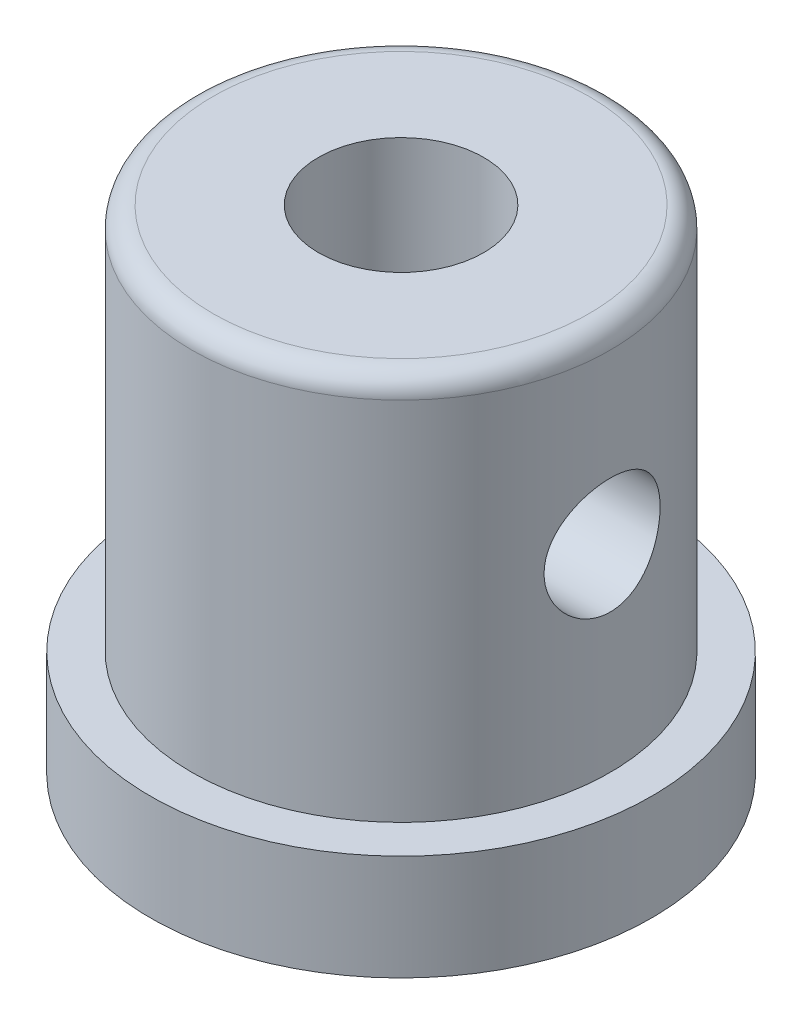
ISO-10303-21;
HEADER;
FILE_DESCRIPTION(('STEP AP214'),'2;1');
FILE_NAME('part.step','',(''),(''),'','','');
FILE_SCHEMA(('AUTOMOTIVE_DESIGN { 1 0 10303 214 1 1 1 1 }'));
ENDSEC;
DATA;
#1=APPLICATION_CONTEXT('core data for automotive mechanical design processes');
#2=APPLICATION_PROTOCOL_DEFINITION('international standard','automotive_design',2000,#1);
#3=PRODUCT_CONTEXT('',#1,'mechanical');
#4=PRODUCT('Part','Part','',(#3));
#5=PRODUCT_RELATED_PRODUCT_CATEGORY('part','',(#4));
#6=PRODUCT_DEFINITION_FORMATION('','',#4);
#7=PRODUCT_DEFINITION_CONTEXT('part definition',#1,'design');
#8=PRODUCT_DEFINITION('design','',#6,#7);
#9=PRODUCT_DEFINITION_SHAPE('','',#8);
#10=(LENGTH_UNIT() NAMED_UNIT(*) SI_UNIT(.MILLI.,.METRE.));
#11=(NAMED_UNIT(*) PLANE_ANGLE_UNIT() SI_UNIT($,.RADIAN.));
#12=(NAMED_UNIT(*) SI_UNIT($,.STERADIAN.) SOLID_ANGLE_UNIT());
#13=UNCERTAINTY_MEASURE_WITH_UNIT(LENGTH_MEASURE(1.E-05),#10,'distance_accuracy_value','');
#14=(GEOMETRIC_REPRESENTATION_CONTEXT(3) GLOBAL_UNCERTAINTY_ASSIGNED_CONTEXT((#13)) GLOBAL_UNIT_ASSIGNED_CONTEXT((#10,
#11,#12)) REPRESENTATION_CONTEXT('',''));
#15=CARTESIAN_POINT('',(0.,0.,0.));
#16=DIRECTION('',(0.,0.,1.));
#17=DIRECTION('',(1.,0.,0.));
#18=AXIS2_PLACEMENT_3D('',#15,#16,#17);
#19=CARTESIAN_POINT('',(-9.051,10.922,0.));
#20=DIRECTION('',(1.,0.,0.));
#21=DIRECTION('',(0.,0.,-1.));
#22=AXIS2_PLACEMENT_3D('',#19,#20,#21);
#23=CYLINDRICAL_SURFACE('',#22,2.0955);
#24=CARTESIAN_POINT('',(-2.12511646739655,10.922,-2.0955));
#25=CARTESIAN_POINT('',(-2.1251229895646,10.8215248435537,-2.0954967634789));
#26=CARTESIAN_POINT('',(-2.13238341424865,10.7210322785754,-2.08820603418596));
#27=CARTESIAN_POINT('',(-2.15987752650757,10.523781326354,-2.05974006863629));
#28=CARTESIAN_POINT('',(-2.18014038760728,10.4270318563669,-2.0385336072699));
#29=CARTESIAN_POINT('',(-2.22981291785987,10.2408693556896,-1.98406174858855));
#30=CARTESIAN_POINT('',(-2.25911845293338,10.1513867526886,-1.95093295921799));
#31=CARTESIAN_POINT('',(-2.32338930708199,9.97945903021945,-1.87393091147776));
#32=CARTESIAN_POINT('',(-2.35835494514694,9.89701430778969,-1.83005704746988));
#33=CARTESIAN_POINT('',(-2.43737066382903,9.72557635896834,-1.72382672843903));
#34=CARTESIAN_POINT('',(-2.48193505500724,9.63799451944853,-1.65957501731225));
#35=CARTESIAN_POINT('',(-2.57084239091867,9.47359264725515,-1.51822313905804));
#36=CARTESIAN_POINT('',(-2.61518498858637,9.39678622432025,-1.44110698791334));
#37=CARTESIAN_POINT('',(-2.70738110256631,9.2432598318638,-1.26065098394023));
#38=CARTESIAN_POINT('',(-2.75457274616829,9.16872258381825,-1.1550820705137));
#39=CARTESIAN_POINT('',(-2.83878278734553,9.03918801224249,-0.928984915009273));
#40=CARTESIAN_POINT('',(-2.87582164823106,8.98415131808344,-0.808487484800463));
#41=CARTESIAN_POINT('',(-2.92708604498824,8.90898285206012,-0.590237098353584));
#42=CARTESIAN_POINT('',(-2.9447723753399,8.88343647164263,-0.495147561274692));
#43=CARTESIAN_POINT('',(-2.97087975140645,8.84589949881277,-0.301106770720081));
#44=CARTESIAN_POINT('',(-2.97930822158653,8.83389804365311,-0.202158677711846));
#45=CARTESIAN_POINT('',(-2.98616451650601,8.82412716089608,-0.00301455461901179));
#46=CARTESIAN_POINT('',(-2.98457265730321,8.82638574575774,0.0971835456121959));
#47=CARTESIAN_POINT('',(-2.97149012211751,8.84506061990218,0.295597782186922));
#48=CARTESIAN_POINT('',(-2.95999670270781,8.86148083295084,0.393813361513779));
#49=CARTESIAN_POINT('',(-2.92848664116792,8.9070122846935,0.583289206551201));
#50=CARTESIAN_POINT('',(-2.90867468150943,8.93581912837996,0.67465817185385));
#51=CARTESIAN_POINT('',(-2.86203880127842,9.0047651750839,0.851063593065157));
#52=CARTESIAN_POINT('',(-2.83521349682414,9.04490661478297,0.936098794928113));
#53=CARTESIAN_POINT('',(-2.7729602737315,9.14024809829338,1.10778031950238));
#54=CARTESIAN_POINT('',(-2.73690496829869,9.19663208575425,1.1935377741165));
#55=CARTESIAN_POINT('',(-2.66072630323856,9.32021547645723,1.35490051023062));
#56=CARTESIAN_POINT('',(-2.62059861580975,9.38742643122286,1.4304947885999));
#57=CARTESIAN_POINT('',(-2.53156161296727,9.54446145565147,1.58354140949738));
#58=CARTESIAN_POINT('',(-2.48236888578026,9.63617903474489,1.65889175934581));
#59=CARTESIAN_POINT('',(-2.38680245671815,9.83203697692237,1.79366257663827));
#60=CARTESIAN_POINT('',(-2.34042811295321,9.93617449522518,1.85308668189411));
#61=CARTESIAN_POINT('',(-2.2663211318794,10.1306858678347,1.94257442898761));
#62=CARTESIAN_POINT('',(-2.23675633042419,10.2186885723992,1.9762490548472));
#63=CARTESIAN_POINT('',(-2.18638920242171,10.400674118883,2.03183584460749));
#64=CARTESIAN_POINT('',(-2.16557050625665,10.4946454066269,2.05377000380315));
#65=CARTESIAN_POINT('',(-2.13585843399763,10.6876818933052,2.08466819204426));
#66=CARTESIAN_POINT('',(-2.12709056353566,10.7867897091394,2.09349579528287));
#67=CARTESIAN_POINT('',(-2.12374763276617,10.9854789396973,2.09689029946923));
#68=CARTESIAN_POINT('',(-2.12916673758012,11.0850601429086,2.091463063204));
#69=CARTESIAN_POINT('',(-2.15129079895377,11.2668819223375,2.06866438898094));
#70=CARTESIAN_POINT('',(-2.16628699780072,11.349579554607,2.0530951984726));
#71=CARTESIAN_POINT('',(-2.20381339684249,11.5109328431794,2.01276062323232));
#72=CARTESIAN_POINT('',(-2.22635166064621,11.5895840689785,1.9879853927066));
#73=CARTESIAN_POINT('',(-2.28858113116406,11.7780034261432,1.91645504552625));
#74=CARTESIAN_POINT('',(-2.3313448990671,11.8849107909834,1.86484579477013));
#75=CARTESIAN_POINT('',(-2.42187774524813,12.0871506708491,1.74567155803268));
#76=CARTESIAN_POINT('',(-2.46965654369978,12.1824599048419,1.67807525592615));
#77=CARTESIAN_POINT('',(-2.56611472298697,12.3623758210272,1.52660445283448));
#78=CARTESIAN_POINT('',(-2.61479358034557,12.44673881068,1.44243941286948));
#79=CARTESIAN_POINT('',(-2.70759480087574,12.6009056918196,1.2596233170664));
#80=CARTESIAN_POINT('',(-2.75172373976766,12.6707307473158,1.16099368034147));
#81=CARTESIAN_POINT('',(-2.82497854795156,12.7836969221591,0.967308879264932));
#82=CARTESIAN_POINT('',(-2.85537454558015,12.8293167692773,0.874186495283847));
#83=CARTESIAN_POINT('',(-2.90770382184955,12.9068024818469,0.680126458787792));
#84=CARTESIAN_POINT('',(-2.92964219176679,12.9386766232383,0.579193552089887));
#85=CARTESIAN_POINT('',(-2.96318415479594,12.9871026927358,0.371363585877874));
#86=CARTESIAN_POINT('',(-2.97472701823964,13.0035646057305,0.264435307049822));
#87=CARTESIAN_POINT('',(-2.98605336228622,13.0197203500603,0.0487072660662007));
#88=CARTESIAN_POINT('',(-2.98584165938653,13.0194210493934,-0.0600917112916268));
#89=CARTESIAN_POINT('',(-2.9743068095764,13.002962779805,-0.265021005328412));
#90=CARTESIAN_POINT('',(-2.96407728552158,12.9883647410419,-0.361345868373985));
#91=CARTESIAN_POINT('',(-2.93497260862525,12.9463943148491,-0.54979152426953));
#92=CARTESIAN_POINT('',(-2.91609583380547,12.9190195308474,-0.641911524840646));
#93=CARTESIAN_POINT('',(-2.8703672083704,12.8516425638113,-0.822949000517527));
#94=CARTESIAN_POINT('',(-2.84327051382223,12.8112499124222,-0.911657393886369));
#95=CARTESIAN_POINT('',(-2.7832588202156,12.7196664611282,-1.08111169933514));
#96=CARTESIAN_POINT('',(-2.75034271305331,12.6684736043419,-1.16185609037915));
#97=CARTESIAN_POINT('',(-2.67524245579586,12.5478467858241,-1.32654826984073));
#98=CARTESIAN_POINT('',(-2.63241365125646,12.4768127847941,-1.40902830157622));
#99=CARTESIAN_POINT('',(-2.54480314733917,12.3233830449453,-1.5617270392343));
#100=CARTESIAN_POINT('',(-2.5000175728299,12.2409639909811,-1.63191989608773));
#101=CARTESIAN_POINT('',(-2.40510272886975,12.0516862892309,-1.76938863733995));
#102=CARTESIAN_POINT('',(-2.35526198698963,11.943026598323,-1.83440932367464));
#103=CARTESIAN_POINT('',(-2.26497436320169,11.7126313585901,-1.9447938966821));
#104=CARTESIAN_POINT('',(-2.22450075731933,11.5909344944825,-1.99021403149452));
#105=CARTESIAN_POINT('',(-2.17168180385178,11.3771142110263,-2.04745094113791));
#106=CARTESIAN_POINT('',(-2.15448721582706,11.2878401021091,-2.06535524088591));
#107=CARTESIAN_POINT('',(-2.13121226827063,11.1063782363855,-2.08936988635401));
#108=CARTESIAN_POINT('',(-2.12511048262636,11.0141964471661,-2.09550296984605));
#109=CARTESIAN_POINT('',(-2.12511646739655,10.922,-2.0955));
#110=B_SPLINE_CURVE_WITH_KNOTS('',3,(#24,#25,#26,#27,#28,#29,#30,#31,#32,#33,#34,#35,#36,#37,
#38,#39,#40,#41,#42,#43,#44,#45,#46,#47,#48,#49,#50,#51,#52,#53,#54,#55,#56,#57,#58,#59,#60,#61,
#62,#63,#64,#65,#66,#67,#68,#69,#70,#71,#72,#73,#74,#75,#76,#77,#78,#79,#80,#81,#82,#83,#84,#85,
#86,#87,#88,#89,#90,#91,#92,#93,#94,#95,#96,#97,#98,#99,#100,#101,#102,#103,#104,#105,#106,#107,
#108,#109),.UNSPECIFIED.,.T.,.F.,(4,2,2,2,2,2,2,2,2,2,2,2,2,2,2,2,2,2,2,2,2,2,2,2,2,2,2,2,2,2,2,
2,2,2,2,2,2,2,2,2,2,2,4),(0.,0.30098721245817,0.602652121544176,0.900965157727624,
1.1992950119765,1.55026499348289,1.90167434694935,2.31212607409308,2.72174433368673,
3.02057077294979,3.31915738897191,3.61833073155383,3.91758699280869,4.2098754816845,
4.50222168886887,4.82735476815247,5.15283706482361,5.53674148507183,5.9205581404621,
6.21578387707059,6.51045456681272,6.80817148322184,7.10576597261045,7.36117408004884,
7.61685613453708,7.99337237472407,8.37063235056923,8.75521621127099,9.13923622687104,
9.46209123393945,9.7847515859101,10.1092848900925,10.433685215972,10.7262167030876,
11.0188030832705,11.3211415703345,11.6235376893283,11.973141847854,12.3234728687684,
12.729740035901,13.1348334481149,13.41155571152,13.6877429065694),.UNSPECIFIED.);
#111=CARTESIAN_POINT('',(-2.12511646739655,10.922,-2.0955));
#112=VERTEX_POINT('',#111);
#113=EDGE_CURVE('E157',#112,#112,#110,.T.);
#114=ORIENTED_EDGE('',*,*,#113,.F.);
#115=EDGE_LOOP('',(#114));
#116=FACE_BOUND('',#115,.T.);
#117=CARTESIAN_POINT('',(-7.26013581140188,10.922,-2.0955));
#118=CARTESIAN_POINT('',(-7.26013761668812,10.8067500624816,-2.09549759346381));
#119=CARTESIAN_POINT('',(-7.26291010255721,10.691475328063,-2.08595970803597));
#120=CARTESIAN_POINT('',(-7.27366396887669,10.4642676302366,-2.04814034573256));
#121=CARTESIAN_POINT('',(-7.28164768799254,10.3523361908086,-2.01985045335734));
#122=CARTESIAN_POINT('',(-7.30185181206456,10.1351352788045,-1.94553872933054));
#123=CARTESIAN_POINT('',(-7.31406592622215,10.0298561872105,-1.89954321552748));
#124=CARTESIAN_POINT('',(-7.34134645189305,9.82848926727225,-1.79120969235599));
#125=CARTESIAN_POINT('',(-7.35641315017045,9.73240236446178,-1.7288700397042));
#126=CARTESIAN_POINT('',(-7.388157915707,9.54954899393752,-1.58781437225918));
#127=CARTESIAN_POINT('',(-7.40486637819405,9.46306791864006,-1.50873515872034));
#128=CARTESIAN_POINT('',(-7.43775055349918,9.30440979437746,-1.33722542043794));
#129=CARTESIAN_POINT('',(-7.45392620705417,9.23223433214239,-1.24479341661169));
#130=CARTESIAN_POINT('',(-7.48426326766367,9.10303108756721,-1.0472071597554));
#131=CARTESIAN_POINT('',(-7.49838465044165,9.0462892683119,-0.941859232889824));
#132=CARTESIAN_POINT('',(-7.52267197573053,8.95143276996239,-0.722660771105556));
#133=CARTESIAN_POINT('',(-7.53283864173004,8.9133146834556,-0.608811795942844));
#134=CARTESIAN_POINT('',(-7.54785606241707,8.85771772215123,-0.378824125783968));
#135=CARTESIAN_POINT('',(-7.55283178033194,8.83975284888046,-0.262811219531966));
#136=CARTESIAN_POINT('',(-7.55734456472549,8.82344086799716,-0.0293185887797901));
#137=CARTESIAN_POINT('',(-7.55688261269669,8.82509022004245,0.0881608671860545));
#138=CARTESIAN_POINT('',(-7.55066267918853,8.84762254061899,0.317860866450932));
#139=CARTESIAN_POINT('',(-7.54504938347377,8.86798007417761,0.430137473704724));
#140=CARTESIAN_POINT('',(-7.52932976354878,8.9264991311891,0.649613578241567));
#141=CARTESIAN_POINT('',(-7.51922317322489,8.96466170914559,0.756812774400715));
#142=CARTESIAN_POINT('',(-7.49544245046326,9.05809558185843,0.964403837465359));
#143=CARTESIAN_POINT('',(-7.48173197405241,9.11354230601478,1.06471241131431));
#144=CARTESIAN_POINT('',(-7.45221381220101,9.23983472069979,1.25477724393658));
#145=CARTESIAN_POINT('',(-7.43640568988983,9.31068362096246,1.34453129718566));
#146=CARTESIAN_POINT('',(-7.40378099656249,9.46853932056281,1.5140761744754));
#147=CARTESIAN_POINT('',(-7.38694836639878,9.55600361218862,1.59343847981326));
#148=CARTESIAN_POINT('',(-7.35463978196087,9.74317161358176,1.7364786165334));
#149=CARTESIAN_POINT('',(-7.33916392499724,9.84287620001927,1.80015532350403));
#150=CARTESIAN_POINT('',(-7.31125261439942,10.052684156806,1.91037895080283));
#151=CARTESIAN_POINT('',(-7.29883965319862,10.1628566778143,1.95680034589339));
#152=CARTESIAN_POINT('',(-7.27873433773039,10.389874400415,2.03031710616412));
#153=CARTESIAN_POINT('',(-7.27104070214191,10.5067177814091,2.05741771736045));
#154=CARTESIAN_POINT('',(-7.26152071158607,10.739730738485,2.09076597315972));
#155=CARTESIAN_POINT('',(-7.2595135136646,10.8558009988571,2.09765660577603));
#156=CARTESIAN_POINT('',(-7.2610972242615,11.0874371151779,2.09216830673025));
#157=CARTESIAN_POINT('',(-7.26468748119386,11.2030030282661,2.07979161793005));
#158=CARTESIAN_POINT('',(-7.27688599544674,11.4278109161588,2.03668874648083));
#159=CARTESIAN_POINT('',(-7.28538618028986,11.5371350397643,2.00635741773804));
#160=CARTESIAN_POINT('',(-7.30633923762196,11.7491418614217,1.9286544426738));
#161=CARTESIAN_POINT('',(-7.31879265664281,11.8518236388097,1.88128044009383));
#162=CARTESIAN_POINT('',(-7.34661382656394,12.0502981172524,1.76955821549377));
#163=CARTESIAN_POINT('',(-7.3620432275733,12.1458720141745,1.70483700381597));
#164=CARTESIAN_POINT('',(-7.39393680545144,12.3250384790875,1.56071383217463));
#165=CARTESIAN_POINT('',(-7.41040119278952,12.4086285987098,1.48130887978781));
#166=CARTESIAN_POINT('',(-7.44313868202186,12.5641675115968,1.30708291710583));
#167=CARTESIAN_POINT('',(-7.45938934186097,12.6356655634984,1.21185441526876));
#168=CARTESIAN_POINT('',(-7.48933816061772,12.7616661040611,1.01037758447759));
#169=CARTESIAN_POINT('',(-7.50303645483598,12.8161694937106,0.90412984011731));
#170=CARTESIAN_POINT('',(-7.52624899851453,12.9061204924766,0.684375331758413));
#171=CARTESIAN_POINT('',(-7.53579474556155,12.9417120242322,0.570930969064792));
#172=CARTESIAN_POINT('',(-7.549765599077,12.9932344317049,0.339364641373159));
#173=CARTESIAN_POINT('',(-7.55419194026483,13.0091700481781,0.221243811375742));
#174=CARTESIAN_POINT('',(-7.55736170999874,13.0206113608235,-0.0121261523300747));
#175=CARTESIAN_POINT('',(-7.55628837481494,13.0167757612948,-0.12734094189147));
#176=CARTESIAN_POINT('',(-7.54899915849139,12.9903268633804,-0.355419388418725));
#177=CARTESIAN_POINT('',(-7.54278349916282,12.9677143749248,-0.468283146579704));
#178=CARTESIAN_POINT('',(-7.52594951258106,12.9047377808521,-0.687595305255443));
#179=CARTESIAN_POINT('',(-7.51536674478524,12.8645168952268,-0.794087744217535));
#180=CARTESIAN_POINT('',(-7.49090067249375,12.7675926325252,-0.998872714707194));
#181=CARTESIAN_POINT('',(-7.47701687748896,12.710886805625,-1.09716402467034));
#182=CARTESIAN_POINT('',(-7.44693490054084,12.5807285012146,-1.28578372677356));
#183=CARTESIAN_POINT('',(-7.4306822091493,12.5068463418672,-1.3758068808445));
#184=CARTESIAN_POINT('',(-7.39789964163447,12.3452347240378,-1.54239964081026));
#185=CARTESIAN_POINT('',(-7.38136969174827,12.2575015266228,-1.6189656022588));
#186=CARTESIAN_POINT('',(-7.34943795633561,12.0681129326806,-1.75832304003897));
#187=CARTESIAN_POINT('',(-7.33407338328145,11.9661708457981,-1.82073424703914));
#188=CARTESIAN_POINT('',(-7.30675670120183,11.7528271674756,-1.92744710787709));
#189=CARTESIAN_POINT('',(-7.2948025365087,11.6414313271748,-1.97175967788497));
#190=CARTESIAN_POINT('',(-7.27717632468943,11.4291717769362,-2.03576201686452));
#191=CARTESIAN_POINT('',(-7.27084038810128,11.329156890043,-2.05810849174657));
#192=CARTESIAN_POINT('',(-7.26231961354318,11.1267676432754,-2.08797753803301));
#193=CARTESIAN_POINT('',(-7.26013420749843,11.0243936082345,-2.09550213808293));
#194=CARTESIAN_POINT('',(-7.26013581140188,10.922,-2.0955));
#195=B_SPLINE_CURVE_WITH_KNOTS('',3,(#117,#118,#119,#120,#121,#122,#123,#124,#125,#126,#127,
#128,#129,#130,#131,#132,#133,#134,#135,#136,#137,#138,#139,#140,#141,#142,#143,#144,#145,#146,
#147,#148,#149,#150,#151,#152,#153,#154,#155,#156,#157,#158,#159,#160,#161,#162,#163,#164,#165,
#166,#167,#168,#169,#170,#171,#172,#173,#174,#175,#176,#177,#178,#179,#180,#181,#182,#183,#184,
#185,#186,#187,#188,#189,#190,#191,#192,#193,#194),.UNSPECIFIED.,.T.,.F.,(4,2,2,2,2,2,2,2,2,2,2,
2,2,2,2,2,2,2,2,2,2,2,2,2,2,2,2,2,2,2,2,2,2,2,2,2,2,2,4),(0.,0.345372942041498,
0.690900985106457,1.03591740205928,1.38096852119569,1.73445778397962,2.08798623267991,
2.44767691771279,2.80730176879226,3.15805413556154,3.50874319294542,3.84987426437348,
4.19102554185204,4.53575880937392,4.88056398651407,5.23679089361915,5.59304332918617,
5.95183886104203,6.31053693490778,6.65769203621531,7.00480672906588,7.34455740318586,
7.68435506807034,8.03214391819195,8.38000372303141,8.73884368037233,9.09766461023309,
9.45371425403741,9.80967800640269,10.1538605866054,10.4980283214646,10.839447277438,
11.1809169975762,11.5320797524985,11.8833374624725,12.2431375183911,12.6027202397419,
12.909608240661,13.2164542354067),.UNSPECIFIED.);
#196=CARTESIAN_POINT('',(-7.26013581140188,10.922,-2.0955));
#197=VERTEX_POINT('',#196);
#198=EDGE_CURVE('E88',#197,#197,#195,.T.);
#199=ORIENTED_EDGE('',*,*,#198,.T.);
#200=EDGE_LOOP('',(#199));
#201=FACE_BOUND('',#200,.T.);
#202=ADVANCED_FACE('F63',(#116,#201),#23,.F.);
#203=CARTESIAN_POINT('',(0.,0.,0.));
#204=DIRECTION('',(0.,1.,0.));
#205=DIRECTION('',(0.,0.,1.));
#206=AXIS2_PLACEMENT_3D('',#203,#204,#205);
#207=PLANE('',#206);
#208=CARTESIAN_POINT('',(0.,0.,0.));
#209=DIRECTION('',(0.,1.,0.));
#210=DIRECTION('',(0.,0.,1.));
#211=AXIS2_PLACEMENT_3D('',#208,#209,#210);
#212=CIRCLE('',#211,2.9845);
#213=CARTESIAN_POINT('',(0.,0.,2.9845));
#214=VERTEX_POINT('',#213);
#215=EDGE_CURVE('E154',#214,#214,#212,.F.);
#216=ORIENTED_EDGE('',*,*,#215,.F.);
#217=EDGE_LOOP('',(#216));
#218=FACE_BOUND('',#217,.T.);
#219=CARTESIAN_POINT('',(0.,0.,0.));
#220=DIRECTION('',(0.,1.,0.));
#221=DIRECTION('',(0.,0.,1.));
#222=AXIS2_PLACEMENT_3D('',#219,#220,#221);
#223=CIRCLE('',#222,9.05);
#224=CARTESIAN_POINT('',(0.,0.,-9.05));
#225=VERTEX_POINT('',#224);
#226=EDGE_CURVE('E81',#225,#225,#223,.T.);
#227=ORIENTED_EDGE('',*,*,#226,.F.);
#228=EDGE_LOOP('',(#227));
#229=FACE_BOUND('',#228,.T.);
#230=ADVANCED_FACE('F123',(#218,#229),#207,.F.);
#231=CARTESIAN_POINT('',(0.,3.81,0.));
#232=DIRECTION('',(0.,-1.,0.));
#233=DIRECTION('',(0.,0.,-1.));
#234=AXIS2_PLACEMENT_3D('',#231,#232,#233);
#235=CYLINDRICAL_SURFACE('',#234,9.05);
#236=CARTESIAN_POINT('',(0.,3.81,0.));
#237=DIRECTION('',(0.,1.,0.));
#238=DIRECTION('',(0.,0.,1.));
#239=AXIS2_PLACEMENT_3D('',#236,#237,#238);
#240=CIRCLE('',#239,9.05);
#241=CARTESIAN_POINT('',(0.,3.81,-9.05));
#242=VERTEX_POINT('',#241);
#243=EDGE_CURVE('E76',#242,#242,#240,.T.);
#244=CARTESIAN_POINT('',(0.,3.81,-9.05));
#245=CARTESIAN_POINT('',(0.,3.7703125,-9.05));
#246=CARTESIAN_POINT('',(0.,3.730625,-9.05));
#247=CARTESIAN_POINT('',(0.,3.65125,-9.05));
#248=CARTESIAN_POINT('',(0.,3.6115625,-9.05));
#249=CARTESIAN_POINT('',(0.,3.5321875,-9.05));
#250=CARTESIAN_POINT('',(0.,3.4925,-9.05));
#251=CARTESIAN_POINT('',(0.,3.413125,-9.05));
#252=CARTESIAN_POINT('',(0.,3.3734375,-9.05));
#253=CARTESIAN_POINT('',(0.,3.2940625,-9.05));
#254=CARTESIAN_POINT('',(0.,3.254375,-9.05));
#255=CARTESIAN_POINT('',(0.,3.175,-9.05));
#256=CARTESIAN_POINT('',(0.,3.1353125,-9.05));
#257=CARTESIAN_POINT('',(0.,3.0559375,-9.05));
#258=CARTESIAN_POINT('',(0.,3.01625,-9.05));
#259=CARTESIAN_POINT('',(0.,2.936875,-9.05));
#260=CARTESIAN_POINT('',(0.,2.8971875,-9.05));
#261=CARTESIAN_POINT('',(0.,2.8178125,-9.05));
#262=CARTESIAN_POINT('',(0.,2.778125,-9.05));
#263=CARTESIAN_POINT('',(0.,2.69875,-9.05));
#264=CARTESIAN_POINT('',(0.,2.6590625,-9.05));
#265=CARTESIAN_POINT('',(0.,2.5796875,-9.05));
#266=CARTESIAN_POINT('',(0.,2.54,-9.05));
#267=CARTESIAN_POINT('',(0.,2.460625,-9.05));
#268=CARTESIAN_POINT('',(0.,2.4209375,-9.05));
#269=CARTESIAN_POINT('',(0.,2.3415625,-9.05));
#270=CARTESIAN_POINT('',(0.,2.301875,-9.05));
#271=CARTESIAN_POINT('',(0.,2.2225,-9.05));
#272=CARTESIAN_POINT('',(0.,2.1828125,-9.05));
#273=CARTESIAN_POINT('',(0.,2.1034375,-9.05));
#274=CARTESIAN_POINT('',(0.,2.06375,-9.05));
#275=CARTESIAN_POINT('',(0.,1.984375,-9.05));
#276=CARTESIAN_POINT('',(0.,1.9446875,-9.05));
#277=CARTESIAN_POINT('',(0.,1.8653125,-9.05));
#278=CARTESIAN_POINT('',(0.,1.825625,-9.05));
#279=CARTESIAN_POINT('',(0.,1.74625,-9.05));
#280=CARTESIAN_POINT('',(0.,1.7065625,-9.05));
#281=CARTESIAN_POINT('',(0.,1.6271875,-9.05));
#282=CARTESIAN_POINT('',(0.,1.5875,-9.05));
#283=CARTESIAN_POINT('',(0.,1.508125,-9.05));
#284=CARTESIAN_POINT('',(0.,1.4684375,-9.05));
#285=CARTESIAN_POINT('',(0.,1.3890625,-9.05));
#286=CARTESIAN_POINT('',(0.,1.349375,-9.05));
#287=CARTESIAN_POINT('',(0.,1.27,-9.05));
#288=CARTESIAN_POINT('',(0.,1.2303125,-9.05));
#289=CARTESIAN_POINT('',(0.,1.1509375,-9.05));
#290=CARTESIAN_POINT('',(0.,1.11125,-9.05));
#291=CARTESIAN_POINT('',(0.,1.031875,-9.05));
#292=CARTESIAN_POINT('',(0.,0.9921875,-9.05));
#293=CARTESIAN_POINT('',(0.,0.9128125,-9.05));
#294=CARTESIAN_POINT('',(0.,0.873125,-9.05));
#295=CARTESIAN_POINT('',(0.,0.79375,-9.05));
#296=CARTESIAN_POINT('',(0.,0.7540625,-9.05));
#297=CARTESIAN_POINT('',(0.,0.6746875,-9.05));
#298=CARTESIAN_POINT('',(0.,0.635,-9.05));
#299=CARTESIAN_POINT('',(0.,0.555625,-9.05));
#300=CARTESIAN_POINT('',(0.,0.5159375,-9.05));
#301=CARTESIAN_POINT('',(0.,0.4365625,-9.05));
#302=CARTESIAN_POINT('',(0.,0.396875,-9.05));
#303=CARTESIAN_POINT('',(0.,0.3175,-9.05));
#304=CARTESIAN_POINT('',(0.,0.2778125,-9.05));
#305=CARTESIAN_POINT('',(0.,0.1984375,-9.05));
#306=CARTESIAN_POINT('',(0.,0.15875,-9.05));
#307=CARTESIAN_POINT('',(0.,0.0793749999999999,-9.05));
#308=CARTESIAN_POINT('',(0.,0.0396874999999999,-9.05));
#309=CARTESIAN_POINT('',(0.,0.,-9.05));
#310=B_SPLINE_CURVE_WITH_KNOTS('',3,(#244,#245,#246,#247,#248,#249,#250,#251,#252,#253,#254,
#255,#256,#257,#258,#259,#260,#261,#262,#263,#264,#265,#266,#267,#268,#269,#270,#271,#272,#273,
#274,#275,#276,#277,#278,#279,#280,#281,#282,#283,#284,#285,#286,#287,#288,#289,#290,#291,#292,
#293,#294,#295,#296,#297,#298,#299,#300,#301,#302,#303,#304,#305,#306,#307,#308,#309),
.UNSPECIFIED.,.F.,.F.,(4,2,2,2,2,2,2,2,2,2,2,2,2,2,2,2,2,2,2,2,2,2,2,2,2,2,2,2,2,2,2,2,4),(0.,
0.1190625,0.238125,0.3571875,0.47625,0.5953125,0.714375,0.8334375,0.9525,1.0715625,1.190625,
1.3096875,1.42875,1.5478125,1.666875,1.7859375,1.905,2.0240625,2.143125,2.2621875,2.38125,
2.5003125,2.619375,2.7384375,2.8575,2.9765625,3.095625,3.2146875,3.33375,3.4528125,3.571875,
3.6909375,3.81),.UNSPECIFIED.);
#311=EDGE_CURVE('BSEAM121',#242,#225,#310,.T.);
#312=ORIENTED_EDGE('',*,*,#243,.F.);
#313=ORIENTED_EDGE('',*,*,#226,.T.);
#314=ORIENTED_EDGE('',*,*,#311,.T.);
#315=ORIENTED_EDGE('',*,*,#311,.F.);
#316=EDGE_LOOP('',(#312,#314,#313,#315));
#317=FACE_BOUND('',#316,.T.);
#318=ADVANCED_FACE('F121',(#317),#235,.T.);
#319=CARTESIAN_POINT('',(0.,3.81,0.));
#320=DIRECTION('',(0.,1.,0.));
#321=DIRECTION('',(0.,0.,1.));
#322=AXIS2_PLACEMENT_3D('',#319,#320,#321);
#323=PLANE('',#322);
#324=CARTESIAN_POINT('',(0.,3.81,0.));
#325=DIRECTION('',(0.,1.,0.));
#326=DIRECTION('',(0.,0.,1.));
#327=AXIS2_PLACEMENT_3D('',#324,#325,#326);
#328=CIRCLE('',#327,7.5565);
#329=CARTESIAN_POINT('',(0.,3.81,7.5565));
#330=VERTEX_POINT('',#329);
#331=EDGE_CURVE('E84',#330,#330,#328,.F.);
#332=ORIENTED_EDGE('',*,*,#331,.T.);
#333=EDGE_LOOP('',(#332));
#334=FACE_BOUND('',#333,.T.);
#335=ORIENTED_EDGE('',*,*,#243,.T.);
#336=EDGE_LOOP('',(#335));
#337=FACE_BOUND('',#336,.T.);
#338=ADVANCED_FACE('F118',(#334,#337),#323,.T.);
#339=CARTESIAN_POINT('',(0.,17.78,0.));
#340=DIRECTION('',(0.,-1.,0.));
#341=DIRECTION('',(0.,0.,-1.));
#342=AXIS2_PLACEMENT_3D('',#339,#340,#341);
#343=CYLINDRICAL_SURFACE('',#342,7.5565);
#344=CARTESIAN_POINT('',(0.,17.018,0.));
#345=DIRECTION('',(0.,1.,0.));
#346=DIRECTION('',(0.,0.,1.));
#347=AXIS2_PLACEMENT_3D('',#344,#345,#346);
#348=CIRCLE('',#347,7.5565);
#349=CARTESIAN_POINT('',(0.,17.018,7.5565));
#350=VERTEX_POINT('',#349);
#351=EDGE_CURVE('E11',#350,#350,#348,.F.);
#352=ORIENTED_EDGE('',*,*,#351,.T.);
#353=EDGE_LOOP('',(#352));
#354=FACE_BOUND('',#353,.T.);
#355=ORIENTED_EDGE('',*,*,#198,.F.);
#356=EDGE_LOOP('',(#355));
#357=FACE_BOUND('',#356,.T.);
#358=CARTESIAN_POINT('',(7.26013581140188,10.922,2.0955));
#359=CARTESIAN_POINT('',(7.26013761668812,11.0372499375184,2.09549759346381));
#360=CARTESIAN_POINT('',(7.26291010255721,11.152524671937,2.08595970803597));
#361=CARTESIAN_POINT('',(7.27366396887669,11.3797323697634,2.04814034573256));
#362=CARTESIAN_POINT('',(7.28164768799254,11.4916638091914,2.01985045335734));
#363=CARTESIAN_POINT('',(7.30185181206456,11.7088647211955,1.94553872933054));
#364=CARTESIAN_POINT('',(7.31406592622215,11.8141438127895,1.89954321552748));
#365=CARTESIAN_POINT('',(7.34134645189305,12.0155107327278,1.79120969235599));
#366=CARTESIAN_POINT('',(7.35641315017045,12.1115976355382,1.7288700397042));
#367=CARTESIAN_POINT('',(7.388157915707,12.2944510060625,1.58781437225918));
#368=CARTESIAN_POINT('',(7.40486637819405,12.3809320813599,1.50873515872034));
#369=CARTESIAN_POINT('',(7.43775055349918,12.5395902056225,1.33722542043794));
#370=CARTESIAN_POINT('',(7.45392620705417,12.6117656678576,1.24479341661169));
#371=CARTESIAN_POINT('',(7.48426326766367,12.7409689124328,1.0472071597554));
#372=CARTESIAN_POINT('',(7.49838465044165,12.7977107316881,0.941859232889824));
#373=CARTESIAN_POINT('',(7.52267197573053,12.8925672300376,0.722660771105556));
#374=CARTESIAN_POINT('',(7.53283864173004,12.9306853165444,0.608811795942844));
#375=CARTESIAN_POINT('',(7.54785606241707,12.9862822778488,0.378824125783968));
#376=CARTESIAN_POINT('',(7.55283178033194,13.0042471511195,0.262811219531966));
#377=CARTESIAN_POINT('',(7.55734456472549,13.0205591320028,0.0293185887797899));
#378=CARTESIAN_POINT('',(7.55688261269669,13.0189097799575,-0.0881608671860545));
#379=CARTESIAN_POINT('',(7.55066267918853,12.996377459381,-0.317860866450932));
#380=CARTESIAN_POINT('',(7.54504938347377,12.9760199258224,-0.430137473704724));
#381=CARTESIAN_POINT('',(7.52932976354878,12.9175008688109,-0.649613578241566));
#382=CARTESIAN_POINT('',(7.51922317322489,12.8793382908544,-0.756812774400715));
#383=CARTESIAN_POINT('',(7.49544245046326,12.7859044181416,-0.964403837465359));
#384=CARTESIAN_POINT('',(7.48173197405241,12.7304576939852,-1.06471241131431));
#385=CARTESIAN_POINT('',(7.45221381220101,12.6041652793002,-1.25477724393658));
#386=CARTESIAN_POINT('',(7.43640568988983,12.5333163790375,-1.34453129718566));
#387=CARTESIAN_POINT('',(7.40378099656249,12.3754606794372,-1.5140761744754));
#388=CARTESIAN_POINT('',(7.38694836639878,12.2879963878114,-1.59343847981326));
#389=CARTESIAN_POINT('',(7.35463978196087,12.1008283864182,-1.7364786165334));
#390=CARTESIAN_POINT('',(7.33916392499724,12.0011237999807,-1.80015532350403));
#391=CARTESIAN_POINT('',(7.31125261439942,11.791315843194,-1.91037895080283));
#392=CARTESIAN_POINT('',(7.29883965319862,11.6811433221857,-1.95680034589339));
#393=CARTESIAN_POINT('',(7.27873433773039,11.454125599585,-2.03031710616412));
#394=CARTESIAN_POINT('',(7.27104070214191,11.3372822185909,-2.05741771736045));
#395=CARTESIAN_POINT('',(7.26152071158607,11.104269261515,-2.09076597315972));
#396=CARTESIAN_POINT('',(7.25951351366461,10.9881990011429,-2.09765660577603));
#397=CARTESIAN_POINT('',(7.2610972242615,10.7565628848221,-2.09216830673025));
#398=CARTESIAN_POINT('',(7.26468748119386,10.6409969717339,-2.07979161793005));
#399=CARTESIAN_POINT('',(7.27688599544674,10.4161890838412,-2.03668874648083));
#400=CARTESIAN_POINT('',(7.28538618028986,10.3068649602357,-2.00635741773804));
#401=CARTESIAN_POINT('',(7.30633923762196,10.0948581385783,-1.9286544426738));
#402=CARTESIAN_POINT('',(7.31879265664281,9.99217636119029,-1.88128044009383));
#403=CARTESIAN_POINT('',(7.34661382656394,9.79370188274763,-1.76955821549377));
#404=CARTESIAN_POINT('',(7.3620432275733,9.69812798582554,-1.70483700381597));
#405=CARTESIAN_POINT('',(7.39393680545144,9.51896152091246,-1.56071383217463));
#406=CARTESIAN_POINT('',(7.41040119278952,9.43537140129017,-1.48130887978781));
#407=CARTESIAN_POINT('',(7.44313868202186,9.27983248840322,-1.30708291710583));
#408=CARTESIAN_POINT('',(7.45938934186097,9.20833443650165,-1.21185441526875));
#409=CARTESIAN_POINT('',(7.48933816061772,9.0823338959389,-1.01037758447759));
#410=CARTESIAN_POINT('',(7.50303645483598,9.02783050628942,-0.904129840117308));
#411=CARTESIAN_POINT('',(7.52624899851453,8.93787950752339,-0.684375331758411));
#412=CARTESIAN_POINT('',(7.53579474556155,8.90228797576775,-0.570930969064791));
#413=CARTESIAN_POINT('',(7.549765599077,8.85076556829513,-0.339364641373158));
#414=CARTESIAN_POINT('',(7.55419194026483,8.83482995182187,-0.221243811375741));
#415=CARTESIAN_POINT('',(7.55736170999874,8.82338863917652,0.0121261523300756));
#416=CARTESIAN_POINT('',(7.55628837481494,8.82722423870525,0.127340941891471));
#417=CARTESIAN_POINT('',(7.54899915849139,8.85367313661965,0.355419388418725));
#418=CARTESIAN_POINT('',(7.54278349916282,8.87628562507518,0.468283146579704));
#419=CARTESIAN_POINT('',(7.52594951258106,8.93926221914794,0.687595305255445));
#420=CARTESIAN_POINT('',(7.51536674478524,8.97948310477322,0.794087744217537));
#421=CARTESIAN_POINT('',(7.49090067249375,9.07640736747478,0.998872714707197));
#422=CARTESIAN_POINT('',(7.47701687748896,9.13311319437498,1.09716402467035));
#423=CARTESIAN_POINT('',(7.44693490054084,9.26327149878541,1.28578372677356));
#424=CARTESIAN_POINT('',(7.4306822091493,9.33715365813281,1.3758068808445));
#425=CARTESIAN_POINT('',(7.39789964163447,9.4987652759622,1.54239964081026));
#426=CARTESIAN_POINT('',(7.38136969174827,9.58649847337717,1.6189656022588));
#427=CARTESIAN_POINT('',(7.34943795633561,9.77588706731942,1.75832304003897));
#428=CARTESIAN_POINT('',(7.33407338328145,9.87782915420186,1.82073424703914));
#429=CARTESIAN_POINT('',(7.30675670120183,10.0911728325244,1.92744710787709));
#430=CARTESIAN_POINT('',(7.2948025365087,10.2025686728252,1.97175967788497));
#431=CARTESIAN_POINT('',(7.27717632468943,10.4148282230638,2.03576201686452));
#432=CARTESIAN_POINT('',(7.27084038810128,10.514843109957,2.05810849174657));
#433=CARTESIAN_POINT('',(7.26231961354318,10.7172323567246,2.08797753803301));
#434=CARTESIAN_POINT('',(7.26013420749843,10.8196063917655,2.09550213808293));
#435=CARTESIAN_POINT('',(7.26013581140188,10.922,2.0955));
#436=B_SPLINE_CURVE_WITH_KNOTS('',3,(#358,#359,#360,#361,#362,#363,#364,#365,#366,#367,#368,
#369,#370,#371,#372,#373,#374,#375,#376,#377,#378,#379,#380,#381,#382,#383,#384,#385,#386,#387,
#388,#389,#390,#391,#392,#393,#394,#395,#396,#397,#398,#399,#400,#401,#402,#403,#404,#405,#406,
#407,#408,#409,#410,#411,#412,#413,#414,#415,#416,#417,#418,#419,#420,#421,#422,#423,#424,#425,
#426,#427,#428,#429,#430,#431,#432,#433,#434,#435),.UNSPECIFIED.,.T.,.F.,(4,2,2,2,2,2,2,2,2,2,2,
2,2,2,2,2,2,2,2,2,2,2,2,2,2,2,2,2,2,2,2,2,2,2,2,2,2,2,4),(0.,0.345372942041498,
0.690900985106457,1.03591740205928,1.38096852119569,1.73445778397962,2.08798623267991,
2.44767691771279,2.80730176879226,3.15805413556154,3.50874319294542,3.84987426437348,
4.19102554185204,4.53575880937392,4.88056398651407,5.23679089361915,5.59304332918617,
5.95183886104203,6.31053693490778,6.65769203621531,7.00480672906589,7.34455740318587,
7.68435506807035,8.03214391819195,8.38000372303141,8.73884368037233,9.0976646102331,
9.45371425403741,9.8096780064027,10.1538605866054,10.4980283214646,10.839447277438,
11.1809169975762,11.5320797524985,11.8833374624725,12.2431375183911,12.6027202397419,
12.909608240661,13.2164542354067),.UNSPECIFIED.);
#437=CARTESIAN_POINT('',(7.26013581140188,10.922,2.0955));
#438=VERTEX_POINT('',#437);
#439=EDGE_CURVE('E100',#438,#438,#436,.T.);
#440=ORIENTED_EDGE('',*,*,#439,.T.);
#441=EDGE_LOOP('',(#440));
#442=FACE_BOUND('',#441,.T.);
#443=ORIENTED_EDGE('',*,*,#331,.F.);
#444=EDGE_LOOP('',(#443));
#445=FACE_BOUND('',#444,.T.);
#446=ADVANCED_FACE('F114',(#354,#357,#442,#445),#343,.T.);
#447=CARTESIAN_POINT('',(0.,17.78,0.));
#448=DIRECTION('',(0.,1.,0.));
#449=DIRECTION('',(0.,0.,1.));
#450=AXIS2_PLACEMENT_3D('',#447,#448,#449);
#451=PLANE('',#450);
#452=CARTESIAN_POINT('',(0.,17.78,0.));
#453=DIRECTION('',(0.,1.,0.));
#454=DIRECTION('',(0.,0.,1.));
#455=AXIS2_PLACEMENT_3D('',#452,#453,#454);
#456=CIRCLE('',#455,2.9845);
#457=CARTESIAN_POINT('',(0.,17.78,2.9845));
#458=VERTEX_POINT('',#457);
#459=EDGE_CURVE('E186',#458,#458,#456,.T.);
#460=ORIENTED_EDGE('',*,*,#459,.F.);
#461=EDGE_LOOP('',(#460));
#462=FACE_BOUND('',#461,.T.);
#463=CARTESIAN_POINT('',(0.,17.78,0.));
#464=DIRECTION('',(0.,1.,0.));
#465=DIRECTION('',(0.,0.,1.));
#466=AXIS2_PLACEMENT_3D('',#463,#464,#465);
#467=CIRCLE('',#466,6.7945);
#468=CARTESIAN_POINT('',(0.,17.78,6.7945));
#469=VERTEX_POINT('',#468);
#470=EDGE_CURVE('E71',#469,#469,#467,.T.);
#471=ORIENTED_EDGE('',*,*,#470,.T.);
#472=EDGE_LOOP('',(#471));
#473=FACE_BOUND('',#472,.T.);
#474=ADVANCED_FACE('F111',(#462,#473),#451,.T.);
#475=CARTESIAN_POINT('',(2.12511646739655,10.922,-2.0955));
#476=CARTESIAN_POINT('',(2.1251229895646,11.0224751564463,-2.0954967634789));
#477=CARTESIAN_POINT('',(2.13238341424865,11.1229677214246,-2.08820603418596));
#478=CARTESIAN_POINT('',(2.15987752650757,11.320218673646,-2.05974006863629));
#479=CARTESIAN_POINT('',(2.18014038760728,11.4169681436331,-2.0385336072699));
#480=CARTESIAN_POINT('',(2.22981291785987,11.6031306443104,-1.98406174858855));
#481=CARTESIAN_POINT('',(2.25911845293338,11.6926132473114,-1.95093295921799));
#482=CARTESIAN_POINT('',(2.32338930708199,11.8645409697805,-1.87393091147776));
#483=CARTESIAN_POINT('',(2.35835494514694,11.9469856922103,-1.83005704746988));
#484=CARTESIAN_POINT('',(2.43737066382903,12.1184236410317,-1.72382672843903));
#485=CARTESIAN_POINT('',(2.48193505500724,12.2060054805515,-1.65957501731225));
#486=CARTESIAN_POINT('',(2.57084239091867,12.3704073527448,-1.51822313905804));
#487=CARTESIAN_POINT('',(2.61518498858637,12.4472137756797,-1.44110698791334));
#488=CARTESIAN_POINT('',(2.70738110256631,12.6007401681362,-1.26065098394023));
#489=CARTESIAN_POINT('',(2.75457274616829,12.6752774161817,-1.15508207051371));
#490=CARTESIAN_POINT('',(2.83878278734553,12.8048119877575,-0.928984915009273));
#491=CARTESIAN_POINT('',(2.87582164823106,12.8598486819166,-0.808487484800463));
#492=CARTESIAN_POINT('',(2.92708604498824,12.9350171479399,-0.590237098353584));
#493=CARTESIAN_POINT('',(2.9447723753399,12.9605635283574,-0.495147561274692));
#494=CARTESIAN_POINT('',(2.97087975140645,12.9981005011872,-0.301106770720081));
#495=CARTESIAN_POINT('',(2.97930822158653,13.0101019563469,-0.202158677711846));
#496=CARTESIAN_POINT('',(2.98616451650601,13.0198728391039,-0.00301455461901179));
#497=CARTESIAN_POINT('',(2.98457265730321,13.0176142542423,0.0971835456121959));
#498=CARTESIAN_POINT('',(2.97149012211751,12.9989393800978,0.295597782186922));
#499=CARTESIAN_POINT('',(2.95999670270781,12.9825191670492,0.393813361513779));
#500=CARTESIAN_POINT('',(2.92848664116792,12.9369877153065,0.583289206551201));
#501=CARTESIAN_POINT('',(2.90867468150943,12.90818087162,0.67465817185385));
#502=CARTESIAN_POINT('',(2.86203880127842,12.8392348249161,0.851063593065157));
#503=CARTESIAN_POINT('',(2.83521349682414,12.799093385217,0.936098794928113));
#504=CARTESIAN_POINT('',(2.7729602737315,12.7037519017066,1.10778031950238));
#505=CARTESIAN_POINT('',(2.73690496829869,12.6473679142457,1.1935377741165));
#506=CARTESIAN_POINT('',(2.66072630323856,12.5237845235428,1.35490051023062));
#507=CARTESIAN_POINT('',(2.62059861580975,12.4565735687771,1.4304947885999));
#508=CARTESIAN_POINT('',(2.53156161296727,12.2995385443485,1.58354140949738));
#509=CARTESIAN_POINT('',(2.48236888578026,12.2078209652551,1.65889175934581));
#510=CARTESIAN_POINT('',(2.38680245671815,12.0119630230776,1.79366257663827));
#511=CARTESIAN_POINT('',(2.34042811295321,11.9078255047748,1.85308668189411));
#512=CARTESIAN_POINT('',(2.2663211318794,11.7133141321653,1.94257442898761));
#513=CARTESIAN_POINT('',(2.23675633042419,11.6253114276008,1.9762490548472));
#514=CARTESIAN_POINT('',(2.18638920242171,11.4433258811169,2.03183584460749));
#515=CARTESIAN_POINT('',(2.16557050625665,11.3493545933731,2.05377000380315));
#516=CARTESIAN_POINT('',(2.13585843399763,11.1563181066948,2.08466819204426));
#517=CARTESIAN_POINT('',(2.12709056353566,11.0572102908606,2.09349579528287));
#518=CARTESIAN_POINT('',(2.12374763276617,10.8585210603027,2.09689029946923));
#519=CARTESIAN_POINT('',(2.12916673758012,10.7589398570914,2.091463063204));
#520=CARTESIAN_POINT('',(2.15129079895377,10.5771180776625,2.06866438898094));
#521=CARTESIAN_POINT('',(2.16628699780072,10.494420445393,2.0530951984726));
#522=CARTESIAN_POINT('',(2.2038133968425,10.3330671568206,2.01276062323232));
#523=CARTESIAN_POINT('',(2.22635166064621,10.2544159310215,1.9879853927066));
#524=CARTESIAN_POINT('',(2.28858113116406,10.0659965738568,1.91645504552625));
#525=CARTESIAN_POINT('',(2.3313448990671,9.95908920901663,1.86484579477013));
#526=CARTESIAN_POINT('',(2.42187774524813,9.75684932915091,1.74567155803268));
#527=CARTESIAN_POINT('',(2.46965654369978,9.66154009515813,1.67807525592615));
#528=CARTESIAN_POINT('',(2.56611472298697,9.48162417897277,1.52660445283448));
#529=CARTESIAN_POINT('',(2.61479358034557,9.39726118932001,1.44243941286948));
#530=CARTESIAN_POINT('',(2.70759480087574,9.24309430818039,1.2596233170664));
#531=CARTESIAN_POINT('',(2.75172373976766,9.17326925268421,1.16099368034147));
#532=CARTESIAN_POINT('',(2.82497854795156,9.0603030778409,0.967308879264932));
#533=CARTESIAN_POINT('',(2.85537454558015,9.01468323072266,0.874186495283847));
#534=CARTESIAN_POINT('',(2.90770382184955,8.93719751815306,0.680126458787792));
#535=CARTESIAN_POINT('',(2.92964219176679,8.90532337676174,0.579193552089887));
#536=CARTESIAN_POINT('',(2.96318415479594,8.85689730726416,0.371363585877874));
#537=CARTESIAN_POINT('',(2.97472701823964,8.84043539426954,0.264435307049822));
#538=CARTESIAN_POINT('',(2.98605336228622,8.82427964993972,0.0487072660662007));
#539=CARTESIAN_POINT('',(2.98584165938653,8.82457895060659,-0.0600917112916268));
#540=CARTESIAN_POINT('',(2.9743068095764,8.84103722019502,-0.265021005328412));
#541=CARTESIAN_POINT('',(2.96407728552158,8.85563525895814,-0.361345868373985));
#542=CARTESIAN_POINT('',(2.93497260862525,8.89760568515086,-0.54979152426953));
#543=CARTESIAN_POINT('',(2.91609583380547,8.92498046915262,-0.641911524840646));
#544=CARTESIAN_POINT('',(2.8703672083704,8.99235743618869,-0.822949000517527));
#545=CARTESIAN_POINT('',(2.84327051382223,9.03275008757775,-0.911657393886369));
#546=CARTESIAN_POINT('',(2.7832588202156,9.12433353887179,-1.08111169933514));
#547=CARTESIAN_POINT('',(2.75034271305331,9.17552639565811,-1.16185609037915));
#548=CARTESIAN_POINT('',(2.67524245579586,9.29615321417595,-1.32654826984073));
#549=CARTESIAN_POINT('',(2.63241365125646,9.36718721520594,-1.40902830157622));
#550=CARTESIAN_POINT('',(2.54480314733917,9.52061695505467,-1.5617270392343));
#551=CARTESIAN_POINT('',(2.5000175728299,9.60303600901893,-1.63191989608773));
#552=CARTESIAN_POINT('',(2.40510272886975,9.79231371076909,-1.76938863733995));
#553=CARTESIAN_POINT('',(2.35526198698963,9.90097340167702,-1.83440932367464));
#554=CARTESIAN_POINT('',(2.26497436320169,10.1313686414099,-1.9447938966821));
#555=CARTESIAN_POINT('',(2.22450075731933,10.2530655055175,-1.99021403149452));
#556=CARTESIAN_POINT('',(2.17168180385178,10.4668857889737,-2.04745094113791));
#557=CARTESIAN_POINT('',(2.15448721582706,10.5561598978909,-2.06535524088591));
#558=CARTESIAN_POINT('',(2.13121226827063,10.7376217636145,-2.08936988635401));
#559=CARTESIAN_POINT('',(2.12511048262636,10.8298035528339,-2.09550296984605));
#560=CARTESIAN_POINT('',(2.12511646739655,10.922,-2.0955));
#561=B_SPLINE_CURVE_WITH_KNOTS('',3,(#475,#476,#477,#478,#479,#480,#481,#482,#483,#484,#485,
#486,#487,#488,#489,#490,#491,#492,#493,#494,#495,#496,#497,#498,#499,#500,#501,#502,#503,#504,
#505,#506,#507,#508,#509,#510,#511,#512,#513,#514,#515,#516,#517,#518,#519,#520,#521,#522,#523,
#524,#525,#526,#527,#528,#529,#530,#531,#532,#533,#534,#535,#536,#537,#538,#539,#540,#541,#542,
#543,#544,#545,#546,#547,#548,#549,#550,#551,#552,#553,#554,#555,#556,#557,#558,#559,#560),
.UNSPECIFIED.,.T.,.F.,(4,2,2,2,2,2,2,2,2,2,2,2,2,2,2,2,2,2,2,2,2,2,2,2,2,2,2,2,2,2,2,2,2,2,2,2,
2,2,2,2,2,2,4),(0.,0.30098721245817,0.602652121544176,0.900965157727624,1.1992950119765,
1.55026499348289,1.90167434694935,2.31212607409308,2.72174433368673,3.02057077294979,
3.31915738897191,3.61833073155383,3.91758699280869,4.2098754816845,4.50222168886887,
4.82735476815247,5.15283706482361,5.53674148507183,5.9205581404621,6.21578387707059,
6.51045456681272,6.80817148322184,7.10576597261045,7.36117408004884,7.61685613453708,
7.99337237472407,8.37063235056923,8.75521621127099,9.13923622687104,9.46209123393945,
9.7847515859101,10.1092848900925,10.433685215972,10.7262167030876,11.0188030832705,
11.3211415703345,11.6235376893283,11.973141847854,12.3234728687684,12.729740035901,
13.1348334481149,13.41155571152,13.6877429065694),.UNSPECIFIED.);
#562=CARTESIAN_POINT('',(2.12511646739655,10.922,-2.0955));
#563=VERTEX_POINT('',#562);
#564=EDGE_CURVE('E149',#563,#563,#561,.T.);
#565=ORIENTED_EDGE('',*,*,#564,.F.);
#566=EDGE_LOOP('',(#565));
#567=FACE_BOUND('',#566,.T.);
#568=ORIENTED_EDGE('',*,*,#439,.F.);
#569=EDGE_LOOP('',(#568));
#570=FACE_BOUND('',#569,.T.);
#571=ADVANCED_FACE('F107',(#567,#570),#23,.F.);
#572=CARTESIAN_POINT('',(0.,17.018,0.));
#573=DIRECTION('',(0.,1.,0.));
#574=DIRECTION('',(0.,0.,1.));
#575=AXIS2_PLACEMENT_3D('',#572,#573,#574);
#576=TOROIDAL_SURFACE('',#575,6.7945,0.762);
#577=ORIENTED_EDGE('',*,*,#351,.F.);
#578=EDGE_LOOP('',(#577));
#579=FACE_BOUND('',#578,.T.);
#580=ORIENTED_EDGE('',*,*,#470,.F.);
#581=EDGE_LOOP('',(#580));
#582=FACE_BOUND('',#581,.T.);
#583=ADVANCED_FACE('F65',(#579,#582),#576,.T.);
#584=CARTESIAN_POINT('',(0.,-0.001000000000001,0.));
#585=DIRECTION('',(0.,1.,0.));
#586=DIRECTION('',(0.,0.,1.));
#587=AXIS2_PLACEMENT_3D('',#584,#585,#586);
#588=CYLINDRICAL_SURFACE('',#587,2.9845);
#589=ORIENTED_EDGE('',*,*,#113,.T.);
#590=EDGE_LOOP('',(#589));
#591=FACE_BOUND('',#590,.T.);
#592=ORIENTED_EDGE('',*,*,#564,.T.);
#593=EDGE_LOOP('',(#592));
#594=FACE_BOUND('',#593,.T.);
#595=ORIENTED_EDGE('',*,*,#459,.T.);
#596=EDGE_LOOP('',(#595));
#597=FACE_BOUND('',#596,.T.);
#598=ORIENTED_EDGE('',*,*,#215,.T.);
#599=EDGE_LOOP('',(#598));
#600=FACE_BOUND('',#599,.T.);
#601=ADVANCED_FACE('F144',(#591,#594,#597,#600),#588,.F.);
#602=CLOSED_SHELL('',(#202,#230,#318,#338,#446,#474,#571,#583,#601));
#603=MANIFOLD_SOLID_BREP('B2',#602);
#604=ADVANCED_BREP_SHAPE_REPRESENTATION('',(#18,#603),#14);
#605=SHAPE_DEFINITION_REPRESENTATION(#9,#604);
ENDSEC;
END-ISO-10303-21;
